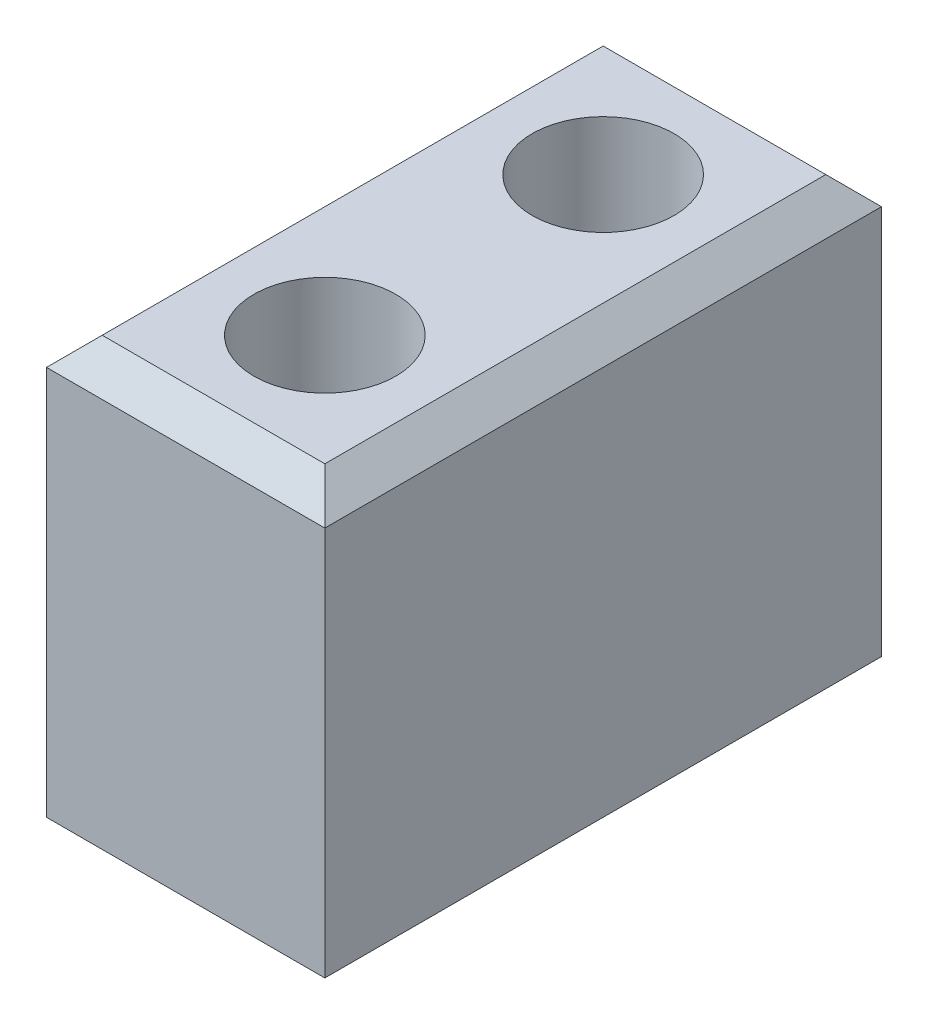
ISO-10303-21;
HEADER;
FILE_DESCRIPTION(('STEP AP214'),'2;1');
FILE_NAME('part.step','',(''),(''),'','','');
FILE_SCHEMA(('AUTOMOTIVE_DESIGN { 1 0 10303 214 1 1 1 1 }'));
ENDSEC;
DATA;
#1=APPLICATION_CONTEXT('core data for automotive mechanical design processes');
#2=APPLICATION_PROTOCOL_DEFINITION('international standard','automotive_design',2000,#1);
#3=PRODUCT_CONTEXT('',#1,'mechanical');
#4=PRODUCT('Part','Part','',(#3));
#5=PRODUCT_RELATED_PRODUCT_CATEGORY('part','',(#4));
#6=PRODUCT_DEFINITION_FORMATION('','',#4);
#7=PRODUCT_DEFINITION_CONTEXT('part definition',#1,'design');
#8=PRODUCT_DEFINITION('design','',#6,#7);
#9=PRODUCT_DEFINITION_SHAPE('','',#8);
#10=(LENGTH_UNIT() NAMED_UNIT(*) SI_UNIT(.MILLI.,.METRE.));
#11=(NAMED_UNIT(*) PLANE_ANGLE_UNIT() SI_UNIT($,.RADIAN.));
#12=(NAMED_UNIT(*) SI_UNIT($,.STERADIAN.) SOLID_ANGLE_UNIT());
#13=UNCERTAINTY_MEASURE_WITH_UNIT(LENGTH_MEASURE(1.E-05),#10,'distance_accuracy_value','');
#14=(GEOMETRIC_REPRESENTATION_CONTEXT(3) GLOBAL_UNCERTAINTY_ASSIGNED_CONTEXT((#13)) GLOBAL_UNIT_ASSIGNED_CONTEXT((#10,
#11,#12)) REPRESENTATION_CONTEXT('',''));
#15=CARTESIAN_POINT('',(0.,0.,0.));
#16=DIRECTION('',(0.,0.,1.));
#17=DIRECTION('',(1.,0.,0.));
#18=AXIS2_PLACEMENT_3D('',#15,#16,#17);
#19=CARTESIAN_POINT('',(10.,15.,20.));
#20=DIRECTION('',(-1.,0.,0.));
#21=DIRECTION('',(0.,0.,1.));
#22=AXIS2_PLACEMENT_3D('',#19,#20,#21);
#23=PLANE('',#22);
#24=DIRECTION('',(0.,-1.,0.));
#25=VECTOR('',#24,1.);
#26=CARTESIAN_POINT('',(10.,15.,-20.));
#27=LINE('',#26,#25);
#28=CARTESIAN_POINT('',(10.,13.,-20.));
#29=VERTEX_POINT('',#28);
#30=CARTESIAN_POINT('',(10.,-15.,-20.));
#31=VERTEX_POINT('',#30);
#32=EDGE_CURVE('E160',#29,#31,#27,.T.);
#33=ORIENTED_EDGE('',*,*,#32,.F.);
#34=DIRECTION('',(0.,0.,1.));
#35=VECTOR('',#34,1.);
#36=CARTESIAN_POINT('',(10.,13.,20.));
#37=LINE('',#36,#35);
#38=CARTESIAN_POINT('',(10.,13.,20.));
#39=VERTEX_POINT('',#38);
#40=EDGE_CURVE('E64',#29,#39,#37,.T.);
#41=ORIENTED_EDGE('',*,*,#40,.T.);
#42=DIRECTION('',(0.,-1.,0.));
#43=VECTOR('',#42,1.);
#44=CARTESIAN_POINT('',(10.,15.,20.));
#45=LINE('',#44,#43);
#46=CARTESIAN_POINT('',(10.,-15.,20.));
#47=VERTEX_POINT('',#46);
#48=EDGE_CURVE('E151',#39,#47,#45,.T.);
#49=ORIENTED_EDGE('',*,*,#48,.T.);
#50=DIRECTION('',(0.,0.,-1.));
#51=VECTOR('',#50,1.);
#52=CARTESIAN_POINT('',(10.,-15.,20.));
#53=LINE('',#52,#51);
#54=EDGE_CURVE('E135',#47,#31,#53,.T.);
#55=ORIENTED_EDGE('',*,*,#54,.T.);
#56=EDGE_LOOP('',(#33,#41,#49,#55));
#57=FACE_BOUND('',#56,.T.);
#58=ADVANCED_FACE('F53',(#57),#23,.F.);
#59=CARTESIAN_POINT('',(-10.,15.,-20.));
#60=DIRECTION('',(0.,0.,1.));
#61=DIRECTION('',(1.,0.,0.));
#62=AXIS2_PLACEMENT_3D('',#59,#60,#61);
#63=PLANE('',#62);
#64=DIRECTION('',(0.,-1.,0.));
#65=VECTOR('',#64,1.);
#66=CARTESIAN_POINT('',(-10.,15.,-20.));
#67=LINE('',#66,#65);
#68=CARTESIAN_POINT('',(-10.,13.,-20.));
#69=VERTEX_POINT('',#68);
#70=CARTESIAN_POINT('',(-10.,-15.,-20.));
#71=VERTEX_POINT('',#70);
#72=EDGE_CURVE('E157',#69,#71,#67,.T.);
#73=ORIENTED_EDGE('',*,*,#72,.F.);
#74=DIRECTION('',(1.,0.,0.));
#75=VECTOR('',#74,1.);
#76=CARTESIAN_POINT('',(-10.,13.,-20.));
#77=LINE('',#76,#75);
#78=EDGE_CURVE('E79',#69,#29,#77,.T.);
#79=ORIENTED_EDGE('',*,*,#78,.T.);
#80=ORIENTED_EDGE('',*,*,#32,.T.);
#81=DIRECTION('',(-1.,0.,0.));
#82=VECTOR('',#81,1.);
#83=CARTESIAN_POINT('',(-10.,-15.,-20.));
#84=LINE('',#83,#82);
#85=EDGE_CURVE('E139',#31,#71,#84,.T.);
#86=ORIENTED_EDGE('',*,*,#85,.T.);
#87=EDGE_LOOP('',(#73,#79,#80,#86));
#88=FACE_BOUND('',#87,.T.);
#89=ADVANCED_FACE('F240',(#88),#63,.F.);
#90=CARTESIAN_POINT('',(-10.,15.,20.));
#91=DIRECTION('',(1.,0.,0.));
#92=DIRECTION('',(0.,0.,-1.));
#93=AXIS2_PLACEMENT_3D('',#90,#91,#92);
#94=PLANE('',#93);
#95=DIRECTION('',(0.,-1.,0.));
#96=VECTOR('',#95,1.);
#97=CARTESIAN_POINT('',(-10.,15.,20.));
#98=LINE('',#97,#96);
#99=CARTESIAN_POINT('',(-10.,13.,20.));
#100=VERTEX_POINT('',#99);
#101=CARTESIAN_POINT('',(-10.,-15.,20.));
#102=VERTEX_POINT('',#101);
#103=EDGE_CURVE('E154',#100,#102,#98,.T.);
#104=ORIENTED_EDGE('',*,*,#103,.F.);
#105=DIRECTION('',(0.,0.,-1.));
#106=VECTOR('',#105,1.);
#107=CARTESIAN_POINT('',(-10.,13.,20.));
#108=LINE('',#107,#106);
#109=EDGE_CURVE('E176',#100,#69,#108,.T.);
#110=ORIENTED_EDGE('',*,*,#109,.T.);
#111=ORIENTED_EDGE('',*,*,#72,.T.);
#112=DIRECTION('',(0.,0.,1.));
#113=VECTOR('',#112,1.);
#114=CARTESIAN_POINT('',(-10.,-15.,20.));
#115=LINE('',#114,#113);
#116=EDGE_CURVE('E143',#71,#102,#115,.T.);
#117=ORIENTED_EDGE('',*,*,#116,.T.);
#118=EDGE_LOOP('',(#104,#110,#111,#117));
#119=FACE_BOUND('',#118,.T.);
#120=ADVANCED_FACE('F212',(#119),#94,.F.);
#121=CARTESIAN_POINT('',(-10.,15.,20.));
#122=DIRECTION('',(0.,0.,-1.));
#123=DIRECTION('',(-1.,0.,0.));
#124=AXIS2_PLACEMENT_3D('',#121,#122,#123);
#125=PLANE('',#124);
#126=ORIENTED_EDGE('',*,*,#48,.F.);
#127=DIRECTION('',(-1.,0.,0.));
#128=VECTOR('',#127,1.);
#129=CARTESIAN_POINT('',(-10.,13.,20.));
#130=LINE('',#129,#128);
#131=EDGE_CURVE('E11',#39,#100,#130,.T.);
#132=ORIENTED_EDGE('',*,*,#131,.T.);
#133=ORIENTED_EDGE('',*,*,#103,.T.);
#134=DIRECTION('',(1.,0.,0.));
#135=VECTOR('',#134,1.);
#136=CARTESIAN_POINT('',(-10.,-15.,20.));
#137=LINE('',#136,#135);
#138=EDGE_CURVE('E147',#102,#47,#137,.T.);
#139=ORIENTED_EDGE('',*,*,#138,.T.);
#140=EDGE_LOOP('',(#126,#132,#133,#139));
#141=FACE_BOUND('',#140,.T.);
#142=ADVANCED_FACE('F209',(#141),#125,.F.);
#143=CARTESIAN_POINT('',(0.,15.,0.));
#144=DIRECTION('',(0.,-1.,0.));
#145=DIRECTION('',(0.,0.,-1.));
#146=AXIS2_PLACEMENT_3D('',#143,#144,#145);
#147=PLANE('',#146);
#148=DIRECTION('',(-1.,0.,0.));
#149=VECTOR('',#148,1.);
#150=CARTESIAN_POINT('',(0.,15.,-18.));
#151=LINE('',#150,#149);
#152=CARTESIAN_POINT('',(8.,15.,-18.));
#153=VERTEX_POINT('',#152);
#154=CARTESIAN_POINT('',(-8.,15.,-18.));
#155=VERTEX_POINT('',#154);
#156=EDGE_CURVE('E169',#153,#155,#151,.T.);
#157=ORIENTED_EDGE('',*,*,#156,.T.);
#158=DIRECTION('',(0.,0.,1.));
#159=VECTOR('',#158,1.);
#160=CARTESIAN_POINT('',(-8.,15.,0.));
#161=LINE('',#160,#159);
#162=CARTESIAN_POINT('',(-8.,15.,18.));
#163=VERTEX_POINT('',#162);
#164=EDGE_CURVE('E172',#155,#163,#161,.T.);
#165=ORIENTED_EDGE('',*,*,#164,.T.);
#166=DIRECTION('',(1.,0.,0.));
#167=VECTOR('',#166,1.);
#168=CARTESIAN_POINT('',(0.,15.,18.));
#169=LINE('',#168,#167);
#170=CARTESIAN_POINT('',(8.,15.,18.));
#171=VERTEX_POINT('',#170);
#172=EDGE_CURVE('E163',#163,#171,#169,.T.);
#173=ORIENTED_EDGE('',*,*,#172,.T.);
#174=DIRECTION('',(0.,0.,-1.));
#175=VECTOR('',#174,1.);
#176=CARTESIAN_POINT('',(8.,15.,0.));
#177=LINE('',#176,#175);
#178=EDGE_CURVE('E166',#171,#153,#177,.T.);
#179=ORIENTED_EDGE('',*,*,#178,.T.);
#180=EDGE_LOOP('',(#157,#165,#173,#179));
#181=FACE_BOUND('',#180,.T.);
#182=CARTESIAN_POINT('',(0.,15.,10.));
#183=DIRECTION('',(0.,1.,0.));
#184=DIRECTION('',(0.,0.,1.));
#185=AXIS2_PLACEMENT_3D('',#182,#183,#184);
#186=CIRCLE('',#185,5.09999999999999);
#187=CARTESIAN_POINT('',(0.,15.,15.1));
#188=VERTEX_POINT('',#187);
#189=EDGE_CURVE('E122',#188,#188,#186,.T.);
#190=ORIENTED_EDGE('',*,*,#189,.F.);
#191=EDGE_LOOP('',(#190));
#192=FACE_BOUND('',#191,.T.);
#193=CARTESIAN_POINT('',(0.,15.,-10.));
#194=DIRECTION('',(0.,1.,0.));
#195=DIRECTION('',(0.,0.,1.));
#196=AXIS2_PLACEMENT_3D('',#193,#194,#195);
#197=CIRCLE('',#196,5.09999999999999);
#198=CARTESIAN_POINT('',(0.,15.,-4.90000000000001));
#199=VERTEX_POINT('',#198);
#200=EDGE_CURVE('E121',#199,#199,#197,.T.);
#201=ORIENTED_EDGE('',*,*,#200,.F.);
#202=EDGE_LOOP('',(#201));
#203=FACE_BOUND('',#202,.T.);
#204=ADVANCED_FACE('F219',(#181,#192,#203),#147,.F.);
#205=CARTESIAN_POINT('',(0.,-15.,0.));
#206=DIRECTION('',(0.,-1.,0.));
#207=DIRECTION('',(0.,0.,-1.));
#208=AXIS2_PLACEMENT_3D('',#205,#206,#207);
#209=PLANE('',#208);
#210=CARTESIAN_POINT('',(0.,-15.,-10.));
#211=DIRECTION('',(0.,1.,0.));
#212=DIRECTION('',(0.,0.,1.));
#213=AXIS2_PLACEMENT_3D('',#210,#211,#212);
#214=CIRCLE('',#213,5.09999999999999);
#215=CARTESIAN_POINT('',(0.,-15.,-4.9));
#216=VERTEX_POINT('',#215);
#217=EDGE_CURVE('E127',#216,#216,#214,.T.);
#218=ORIENTED_EDGE('',*,*,#217,.T.);
#219=EDGE_LOOP('',(#218));
#220=FACE_BOUND('',#219,.T.);
#221=ORIENTED_EDGE('',*,*,#54,.F.);
#222=ORIENTED_EDGE('',*,*,#138,.F.);
#223=ORIENTED_EDGE('',*,*,#116,.F.);
#224=ORIENTED_EDGE('',*,*,#85,.F.);
#225=EDGE_LOOP('',(#221,#222,#223,#224));
#226=FACE_BOUND('',#225,.T.);
#227=ADVANCED_FACE('F222',(#220,#226),#209,.T.);
#228=CARTESIAN_POINT('',(0.,15.,-10.));
#229=DIRECTION('',(0.,1.,0.));
#230=DIRECTION('',(0.,0.,1.));
#231=AXIS2_PLACEMENT_3D('',#228,#229,#230);
#232=CYLINDRICAL_SURFACE('',#231,5.09999999999999);
#233=ORIENTED_EDGE('',*,*,#217,.F.);
#234=EDGE_LOOP('',(#233));
#235=FACE_BOUND('',#234,.T.);
#236=ORIENTED_EDGE('',*,*,#200,.T.);
#237=EDGE_LOOP('',(#236));
#238=FACE_BOUND('',#237,.T.);
#239=ADVANCED_FACE('F114',(#235,#238),#232,.F.);
#240=CARTESIAN_POINT('',(0.,-10.,10.));
#241=DIRECTION('',(0.,1.,0.));
#242=DIRECTION('',(0.,0.,1.));
#243=AXIS2_PLACEMENT_3D('',#240,#241,#242);
#244=CONICAL_SURFACE('',#243,5.09999999999999,1.02974425867665);
#245=CARTESIAN_POINT('',(0.,-13.0643891570406,10.));
#246=VERTEX_POINT('',#245);
#247=VERTEX_LOOP('',#246);
#248=FACE_BOUND('',#247,.T.);
#249=CARTESIAN_POINT('',(0.,-10.,10.));
#250=DIRECTION('',(0.,1.,0.));
#251=DIRECTION('',(0.,0.,1.));
#252=AXIS2_PLACEMENT_3D('',#249,#250,#251);
#253=CIRCLE('',#252,5.09999999999999);
#254=CARTESIAN_POINT('',(0.,-10.,15.1));
#255=VERTEX_POINT('',#254);
#256=EDGE_CURVE('E118',#255,#255,#253,.T.);
#257=ORIENTED_EDGE('',*,*,#256,.T.);
#258=EDGE_LOOP('',(#257));
#259=FACE_BOUND('',#258,.T.);
#260=ADVANCED_FACE('F110',(#248,#259),#244,.F.);
#261=CARTESIAN_POINT('',(0.,15.,10.));
#262=DIRECTION('',(0.,1.,0.));
#263=DIRECTION('',(0.,0.,1.));
#264=AXIS2_PLACEMENT_3D('',#261,#262,#263);
#265=CYLINDRICAL_SURFACE('',#264,5.09999999999999);
#266=ORIENTED_EDGE('',*,*,#256,.F.);
#267=EDGE_LOOP('',(#266));
#268=FACE_BOUND('',#267,.T.);
#269=ORIENTED_EDGE('',*,*,#189,.T.);
#270=EDGE_LOOP('',(#269));
#271=FACE_BOUND('',#270,.T.);
#272=ADVANCED_FACE('F113',(#268,#271),#265,.F.);
#273=CARTESIAN_POINT('',(8.,15.,0.));
#274=DIRECTION('',(-0.707106781186549,-0.707106781186546,0.));
#275=DIRECTION('',(0.,0.,-1.));
#276=AXIS2_PLACEMENT_3D('',#273,#274,#275);
#277=PLANE('',#276);
#278=DIRECTION('',(-0.577350269189625,0.577350269189627,-0.577350269189625));
#279=VECTOR('',#278,1.);
#280=CARTESIAN_POINT('',(5.33333333333334,17.6666666666667,15.3333333333333));
#281=LINE('',#280,#279);
#282=EDGE_CURVE('E189',#39,#171,#281,.T.);
#283=ORIENTED_EDGE('',*,*,#282,.F.);
#284=ORIENTED_EDGE('',*,*,#40,.F.);
#285=DIRECTION('',(-0.577350269189625,0.577350269189627,0.577350269189625));
#286=VECTOR('',#285,1.);
#287=CARTESIAN_POINT('',(2.00000000000001,21.,-12.));
#288=LINE('',#287,#286);
#289=EDGE_CURVE('E58',#153,#29,#288,.F.);
#290=ORIENTED_EDGE('',*,*,#289,.F.);
#291=ORIENTED_EDGE('',*,*,#178,.F.);
#292=EDGE_LOOP('',(#283,#284,#290,#291));
#293=FACE_BOUND('',#292,.T.);
#294=ADVANCED_FACE('F56',(#293),#277,.F.);
#295=CARTESIAN_POINT('',(0.,15.,-18.));
#296=DIRECTION('',(0.,-0.707106781186546,0.707106781186549));
#297=DIRECTION('',(-1.,0.,0.));
#298=AXIS2_PLACEMENT_3D('',#295,#296,#297);
#299=PLANE('',#298);
#300=ORIENTED_EDGE('',*,*,#289,.T.);
#301=ORIENTED_EDGE('',*,*,#78,.F.);
#302=DIRECTION('',(0.577350269189625,0.577350269189627,0.577350269189625));
#303=VECTOR('',#302,1.);
#304=CARTESIAN_POINT('',(-5.33333333333334,17.6666666666667,-15.3333333333333));
#305=LINE('',#304,#303);
#306=EDGE_CURVE('E187',#155,#69,#305,.F.);
#307=ORIENTED_EDGE('',*,*,#306,.F.);
#308=ORIENTED_EDGE('',*,*,#156,.F.);
#309=EDGE_LOOP('',(#300,#301,#307,#308));
#310=FACE_BOUND('',#309,.T.);
#311=ADVANCED_FACE('F201',(#310),#299,.F.);
#312=CARTESIAN_POINT('',(0.,15.,18.));
#313=DIRECTION('',(0.,-0.707106781186546,-0.707106781186549));
#314=DIRECTION('',(1.,0.,0.));
#315=AXIS2_PLACEMENT_3D('',#312,#313,#314);
#316=PLANE('',#315);
#317=ORIENTED_EDGE('',*,*,#282,.T.);
#318=ORIENTED_EDGE('',*,*,#172,.F.);
#319=DIRECTION('',(-0.577350269189625,-0.577350269189627,0.577350269189625));
#320=VECTOR('',#319,1.);
#321=CARTESIAN_POINT('',(-5.33333333333334,17.6666666666667,15.3333333333333));
#322=LINE('',#321,#320);
#323=EDGE_CURVE('E184',#100,#163,#322,.F.);
#324=ORIENTED_EDGE('',*,*,#323,.F.);
#325=ORIENTED_EDGE('',*,*,#131,.F.);
#326=EDGE_LOOP('',(#317,#318,#324,#325));
#327=FACE_BOUND('',#326,.T.);
#328=ADVANCED_FACE('F206',(#327),#316,.F.);
#329=CARTESIAN_POINT('',(-8.,15.,0.));
#330=DIRECTION('',(0.707106781186549,-0.707106781186546,0.));
#331=DIRECTION('',(0.,0.,1.));
#332=AXIS2_PLACEMENT_3D('',#329,#330,#331);
#333=PLANE('',#332);
#334=ORIENTED_EDGE('',*,*,#306,.T.);
#335=ORIENTED_EDGE('',*,*,#109,.F.);
#336=ORIENTED_EDGE('',*,*,#323,.T.);
#337=ORIENTED_EDGE('',*,*,#164,.F.);
#338=EDGE_LOOP('',(#334,#335,#336,#337));
#339=FACE_BOUND('',#338,.T.);
#340=ADVANCED_FACE('F216',(#339),#333,.F.);
#341=CLOSED_SHELL('',(#58,#89,#120,#142,#204,#227,#239,#260,#272,#294,#311,#328,#340));
#342=MANIFOLD_SOLID_BREP('B2',#341);
#343=ADVANCED_BREP_SHAPE_REPRESENTATION('',(#18,#342),#14);
#344=SHAPE_DEFINITION_REPRESENTATION(#9,#343);
ENDSEC;
END-ISO-10303-21;
